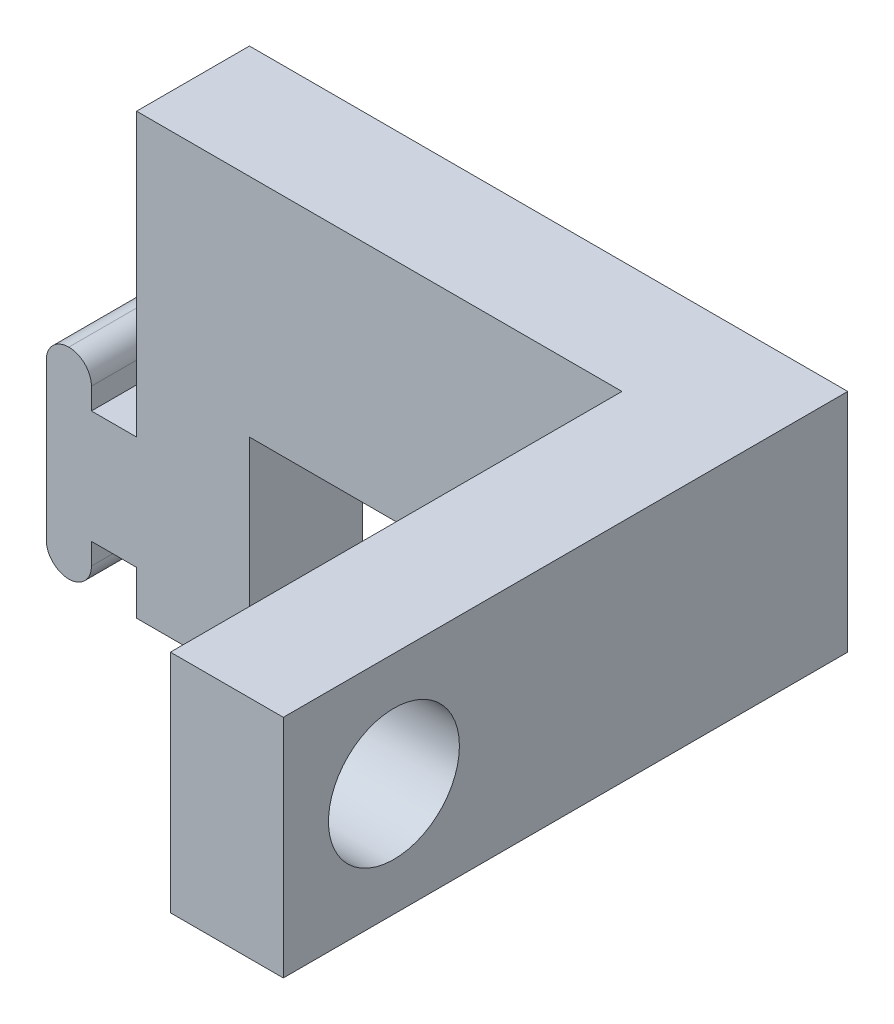
ISO-10303-21;
HEADER;
FILE_DESCRIPTION(('STEP AP214'),'2;1');
FILE_NAME('part.step','',(''),(''),'','','');
FILE_SCHEMA(('AUTOMOTIVE_DESIGN { 1 0 10303 214 1 1 1 1 }'));
ENDSEC;
DATA;
#1=APPLICATION_CONTEXT('core data for automotive mechanical design processes');
#2=APPLICATION_PROTOCOL_DEFINITION('international standard','automotive_design',2000,#1);
#3=PRODUCT_CONTEXT('',#1,'mechanical');
#4=PRODUCT('Part','Part','',(#3));
#5=PRODUCT_RELATED_PRODUCT_CATEGORY('part','',(#4));
#6=PRODUCT_DEFINITION_FORMATION('','',#4);
#7=PRODUCT_DEFINITION_CONTEXT('part definition',#1,'design');
#8=PRODUCT_DEFINITION('design','',#6,#7);
#9=PRODUCT_DEFINITION_SHAPE('','',#8);
#10=(LENGTH_UNIT() NAMED_UNIT(*) SI_UNIT(.MILLI.,.METRE.));
#11=(NAMED_UNIT(*) PLANE_ANGLE_UNIT() SI_UNIT($,.RADIAN.));
#12=(NAMED_UNIT(*) SI_UNIT($,.STERADIAN.) SOLID_ANGLE_UNIT());
#13=UNCERTAINTY_MEASURE_WITH_UNIT(LENGTH_MEASURE(1.E-05),#10,'distance_accuracy_value','');
#14=(GEOMETRIC_REPRESENTATION_CONTEXT(3) GLOBAL_UNCERTAINTY_ASSIGNED_CONTEXT((#13)) GLOBAL_UNIT_ASSIGNED_CONTEXT((#10,
#11,#12)) REPRESENTATION_CONTEXT('',''));
#15=CARTESIAN_POINT('',(0.,0.,0.));
#16=DIRECTION('',(0.,0.,1.));
#17=DIRECTION('',(1.,0.,0.));
#18=AXIS2_PLACEMENT_3D('',#15,#16,#17);
#19=CARTESIAN_POINT('',(-6.35,12.7,0.));
#20=DIRECTION('',(0.,0.,-1.));
#21=DIRECTION('',(-1.,0.,0.));
#22=AXIS2_PLACEMENT_3D('',#19,#20,#21);
#23=PLANE('',#22);
#24=DIRECTION('',(1.,0.,0.));
#25=VECTOR('',#24,1.);
#26=CARTESIAN_POINT('',(-6.35,0.,0.));
#27=LINE('',#26,#25);
#28=CARTESIAN_POINT('',(-6.35,0.,0.));
#29=VERTEX_POINT('',#28);
#30=CARTESIAN_POINT('',(0.,0.,0.));
#31=VERTEX_POINT('',#30);
#32=EDGE_CURVE('E239',#29,#31,#27,.T.);
#33=ORIENTED_EDGE('',*,*,#32,.T.);
#34=DIRECTION('',(0.,-1.,0.));
#35=VECTOR('',#34,1.);
#36=CARTESIAN_POINT('',(0.,12.7,0.));
#37=LINE('',#36,#35);
#38=CARTESIAN_POINT('',(0.,12.7,0.));
#39=VERTEX_POINT('',#38);
#40=EDGE_CURVE('E277',#39,#31,#37,.T.);
#41=ORIENTED_EDGE('',*,*,#40,.F.);
#42=DIRECTION('',(1.,0.,0.));
#43=VECTOR('',#42,1.);
#44=CARTESIAN_POINT('',(-6.35,12.7,0.));
#45=LINE('',#44,#43);
#46=CARTESIAN_POINT('',(-6.35,12.7,0.));
#47=VERTEX_POINT('',#46);
#48=EDGE_CURVE('E252',#47,#39,#45,.T.);
#49=ORIENTED_EDGE('',*,*,#48,.F.);
#50=DIRECTION('',(0.,-1.,0.));
#51=VECTOR('',#50,1.);
#52=CARTESIAN_POINT('',(-6.35,12.7,0.));
#53=LINE('',#52,#51);
#54=EDGE_CURVE('E263',#47,#29,#53,.T.);
#55=ORIENTED_EDGE('',*,*,#54,.T.);
#56=EDGE_LOOP('',(#33,#41,#49,#55));
#57=FACE_BOUND('',#56,.T.);
#58=ADVANCED_FACE('F35',(#57),#23,.F.);
#59=CARTESIAN_POINT('',(0.,12.7,0.));
#60=DIRECTION('',(-1.,0.,0.));
#61=DIRECTION('',(0.,0.,1.));
#62=AXIS2_PLACEMENT_3D('',#59,#60,#61);
#63=PLANE('',#62);
#64=CARTESIAN_POINT('',(0.,6.35,-6.223));
#65=DIRECTION('',(-1.,0.,0.));
#66=DIRECTION('',(0.,0.,1.));
#67=AXIS2_PLACEMENT_3D('',#64,#65,#66);
#68=CIRCLE('',#67,3.683);
#69=CARTESIAN_POINT('',(0.,6.35,-9.906));
#70=VERTEX_POINT('',#69);
#71=EDGE_CURVE('E196',#70,#70,#68,.T.);
#72=ORIENTED_EDGE('',*,*,#71,.T.);
#73=EDGE_LOOP('',(#72));
#74=FACE_BOUND('',#73,.T.);
#75=DIRECTION('',(0.,0.,-1.));
#76=VECTOR('',#75,1.);
#77=CARTESIAN_POINT('',(0.,0.,0.));
#78=LINE('',#77,#76);
#79=CARTESIAN_POINT('',(0.,0.,-31.75));
#80=VERTEX_POINT('',#79);
#81=EDGE_CURVE('E266',#31,#80,#78,.T.);
#82=ORIENTED_EDGE('',*,*,#81,.T.);
#83=DIRECTION('',(0.,-1.,0.));
#84=VECTOR('',#83,1.);
#85=CARTESIAN_POINT('',(0.,12.7,-31.75));
#86=LINE('',#85,#84);
#87=CARTESIAN_POINT('',(0.,12.7,-31.75));
#88=VERTEX_POINT('',#87);
#89=EDGE_CURVE('E274',#88,#80,#86,.T.);
#90=ORIENTED_EDGE('',*,*,#89,.F.);
#91=DIRECTION('',(0.,0.,-1.));
#92=VECTOR('',#91,1.);
#93=CARTESIAN_POINT('',(0.,12.7,0.));
#94=LINE('',#93,#92);
#95=EDGE_CURVE('E255',#39,#88,#94,.T.);
#96=ORIENTED_EDGE('',*,*,#95,.F.);
#97=ORIENTED_EDGE('',*,*,#40,.T.);
#98=EDGE_LOOP('',(#82,#90,#96,#97));
#99=FACE_BOUND('',#98,.T.);
#100=ADVANCED_FACE('F326',(#74,#99),#63,.F.);
#101=CARTESIAN_POINT('',(0.,12.7,-31.75));
#102=DIRECTION('',(0.,0.,1.));
#103=DIRECTION('',(1.,0.,0.));
#104=AXIS2_PLACEMENT_3D('',#101,#102,#103);
#105=PLANE('',#104);
#106=DIRECTION('',(0.,-1.,0.));
#107=VECTOR('',#106,1.);
#108=CARTESIAN_POINT('',(-36.195,-9.525,-31.75));
#109=LINE('',#108,#107);
#110=CARTESIAN_POINT('',(-36.195,-9.525,-31.75));
#111=VERTEX_POINT('',#110);
#112=CARTESIAN_POINT('',(-36.195,-10.7315,-31.75));
#113=VERTEX_POINT('',#112);
#114=EDGE_CURVE('E226',#111,#113,#109,.T.);
#115=ORIENTED_EDGE('',*,*,#114,.T.);
#116=CARTESIAN_POINT('',(-37.465,-10.7315,-31.75));
#117=DIRECTION('',(0.,0.,1.));
#118=DIRECTION('',(1.,0.,0.));
#119=AXIS2_PLACEMENT_3D('',#116,#117,#118);
#120=CIRCLE('',#119,1.27);
#121=CARTESIAN_POINT('',(-37.465,-12.0015,-31.75));
#122=VERTEX_POINT('',#121);
#123=EDGE_CURVE('E296',#113,#122,#120,.F.);
#124=ORIENTED_EDGE('',*,*,#123,.T.);
#125=CARTESIAN_POINT('',(-37.465,-10.7315,-31.75));
#126=DIRECTION('',(0.,0.,1.));
#127=DIRECTION('',(1.,0.,0.));
#128=AXIS2_PLACEMENT_3D('',#125,#126,#127);
#129=CIRCLE('',#128,1.27);
#130=CARTESIAN_POINT('',(-38.735,-10.7315,-31.75));
#131=VERTEX_POINT('',#130);
#132=EDGE_CURVE('E294',#122,#131,#129,.F.);
#133=ORIENTED_EDGE('',*,*,#132,.T.);
#134=DIRECTION('',(0.,1.,0.));
#135=VECTOR('',#134,1.);
#136=CARTESIAN_POINT('',(-38.735,-0.698499999999999,-31.75));
#137=LINE('',#136,#135);
#138=CARTESIAN_POINT('',(-38.735,-1.9685,-31.75));
#139=VERTEX_POINT('',#138);
#140=EDGE_CURVE('E229',#131,#139,#137,.T.);
#141=ORIENTED_EDGE('',*,*,#140,.T.);
#142=CARTESIAN_POINT('',(-37.465,-1.9685,-31.75));
#143=DIRECTION('',(0.,0.,1.));
#144=DIRECTION('',(1.,0.,0.));
#145=AXIS2_PLACEMENT_3D('',#142,#143,#144);
#146=CIRCLE('',#145,1.27);
#147=CARTESIAN_POINT('',(-37.465,-0.698499999999999,-31.75));
#148=VERTEX_POINT('',#147);
#149=EDGE_CURVE('E292',#139,#148,#146,.F.);
#150=ORIENTED_EDGE('',*,*,#149,.T.);
#151=CARTESIAN_POINT('',(-37.465,-1.9685,-31.75));
#152=DIRECTION('',(0.,0.,1.));
#153=DIRECTION('',(1.,0.,0.));
#154=AXIS2_PLACEMENT_3D('',#151,#152,#153);
#155=CIRCLE('',#154,1.27);
#156=CARTESIAN_POINT('',(-36.195,-1.9685,-31.75));
#157=VERTEX_POINT('',#156);
#158=EDGE_CURVE('E283',#148,#157,#155,.F.);
#159=ORIENTED_EDGE('',*,*,#158,.T.);
#160=DIRECTION('',(0.,-1.,0.));
#161=VECTOR('',#160,1.);
#162=CARTESIAN_POINT('',(-36.195,-3.175,-31.75));
#163=LINE('',#162,#161);
#164=CARTESIAN_POINT('',(-36.195,-3.175,-31.75));
#165=VERTEX_POINT('',#164);
#166=EDGE_CURVE('E232',#157,#165,#163,.T.);
#167=ORIENTED_EDGE('',*,*,#166,.T.);
#168=DIRECTION('',(1.,0.,0.));
#169=VECTOR('',#168,1.);
#170=CARTESIAN_POINT('',(-33.655,-3.175,-31.75));
#171=LINE('',#170,#169);
#172=CARTESIAN_POINT('',(-33.655,-3.175,-31.75));
#173=VERTEX_POINT('',#172);
#174=EDGE_CURVE('E193',#165,#173,#171,.T.);
#175=ORIENTED_EDGE('',*,*,#174,.T.);
#176=DIRECTION('',(0.,1.,0.));
#177=VECTOR('',#176,1.);
#178=CARTESIAN_POINT('',(-33.655,12.7,-31.75));
#179=LINE('',#178,#177);
#180=CARTESIAN_POINT('',(-33.655,12.7,-31.75));
#181=VERTEX_POINT('',#180);
#182=EDGE_CURVE('E188',#173,#181,#179,.T.);
#183=ORIENTED_EDGE('',*,*,#182,.T.);
#184=DIRECTION('',(-1.,0.,0.));
#185=VECTOR('',#184,1.);
#186=CARTESIAN_POINT('',(0.,12.7,-31.75));
#187=LINE('',#186,#185);
#188=EDGE_CURVE('E257',#88,#181,#187,.T.);
#189=ORIENTED_EDGE('',*,*,#188,.F.);
#190=ORIENTED_EDGE('',*,*,#89,.T.);
#191=DIRECTION('',(-1.,0.,0.));
#192=VECTOR('',#191,1.);
#193=CARTESIAN_POINT('',(0.,0.,-31.75));
#194=LINE('',#193,#192);
#195=CARTESIAN_POINT('',(-27.305,0.,-31.75));
#196=VERTEX_POINT('',#195);
#197=EDGE_CURVE('E172',#80,#196,#194,.T.);
#198=ORIENTED_EDGE('',*,*,#197,.T.);
#199=DIRECTION('',(0.,-1.,0.));
#200=VECTOR('',#199,1.);
#201=CARTESIAN_POINT('',(-27.305,-12.0015,-31.75));
#202=LINE('',#201,#200);
#203=CARTESIAN_POINT('',(-27.305,-12.0015,-31.75));
#204=VERTEX_POINT('',#203);
#205=EDGE_CURVE('E179',#196,#204,#202,.T.);
#206=ORIENTED_EDGE('',*,*,#205,.T.);
#207=DIRECTION('',(-1.,0.,0.));
#208=VECTOR('',#207,1.);
#209=CARTESIAN_POINT('',(-27.305,-12.0015,-31.75));
#210=LINE('',#209,#208);
#211=CARTESIAN_POINT('',(-33.655,-12.0015,-31.75));
#212=VERTEX_POINT('',#211);
#213=EDGE_CURVE('E216',#204,#212,#210,.T.);
#214=ORIENTED_EDGE('',*,*,#213,.T.);
#215=DIRECTION('',(0.,1.,0.));
#216=VECTOR('',#215,1.);
#217=CARTESIAN_POINT('',(-33.655,-12.0015,-31.75));
#218=LINE('',#217,#216);
#219=CARTESIAN_POINT('',(-33.655,-9.525,-31.75));
#220=VERTEX_POINT('',#219);
#221=EDGE_CURVE('E220',#212,#220,#218,.T.);
#222=ORIENTED_EDGE('',*,*,#221,.T.);
#223=DIRECTION('',(-1.,0.,0.));
#224=VECTOR('',#223,1.);
#225=CARTESIAN_POINT('',(-33.655,-9.525,-31.75));
#226=LINE('',#225,#224);
#227=EDGE_CURVE('E223',#220,#111,#226,.T.);
#228=ORIENTED_EDGE('',*,*,#227,.T.);
#229=EDGE_LOOP('',(#115,#124,#133,#141,#150,#159,#167,#175,#183,#189,#190,#198,#206,#214,#222,#228));
#230=FACE_BOUND('',#229,.T.);
#231=ADVANCED_FACE('F332',(#230),#105,.F.);
#232=CARTESIAN_POINT('',(-22.86,12.7,-25.4));
#233=DIRECTION('',(0.,0.,-1.));
#234=DIRECTION('',(-1.,0.,0.));
#235=AXIS2_PLACEMENT_3D('',#232,#233,#234);
#236=PLANE('',#235);
#237=CARTESIAN_POINT('',(-37.465,-10.7315,-25.4));
#238=DIRECTION('',(0.,0.,-1.));
#239=DIRECTION('',(-1.,0.,0.));
#240=AXIS2_PLACEMENT_3D('',#237,#238,#239);
#241=CIRCLE('',#240,1.27);
#242=CARTESIAN_POINT('',(-38.735,-10.7315,-25.4));
#243=VERTEX_POINT('',#242);
#244=CARTESIAN_POINT('',(-37.465,-12.0015,-25.4));
#245=VERTEX_POINT('',#244);
#246=EDGE_CURVE('E52',#243,#245,#241,.F.);
#247=ORIENTED_EDGE('',*,*,#246,.T.);
#248=CARTESIAN_POINT('',(-37.465,-10.7315,-25.4));
#249=DIRECTION('',(0.,0.,-1.));
#250=DIRECTION('',(-1.,0.,0.));
#251=AXIS2_PLACEMENT_3D('',#248,#249,#250);
#252=CIRCLE('',#251,1.27);
#253=CARTESIAN_POINT('',(-36.195,-10.7315,-25.4));
#254=VERTEX_POINT('',#253);
#255=EDGE_CURVE('E300',#245,#254,#252,.F.);
#256=ORIENTED_EDGE('',*,*,#255,.T.);
#257=DIRECTION('',(0.,-1.,0.));
#258=VECTOR('',#257,1.);
#259=CARTESIAN_POINT('',(-36.195,-9.525,-25.4));
#260=LINE('',#259,#258);
#261=CARTESIAN_POINT('',(-36.195,-9.525,-25.4));
#262=VERTEX_POINT('',#261);
#263=EDGE_CURVE('E203',#262,#254,#260,.T.);
#264=ORIENTED_EDGE('',*,*,#263,.F.);
#265=DIRECTION('',(-1.,0.,0.));
#266=VECTOR('',#265,1.);
#267=CARTESIAN_POINT('',(-33.655,-9.525,-25.4));
#268=LINE('',#267,#266);
#269=CARTESIAN_POINT('',(-33.655,-9.525,-25.4));
#270=VERTEX_POINT('',#269);
#271=EDGE_CURVE('E200',#270,#262,#268,.T.);
#272=ORIENTED_EDGE('',*,*,#271,.F.);
#273=DIRECTION('',(0.,1.,0.));
#274=VECTOR('',#273,1.);
#275=CARTESIAN_POINT('',(-33.655,-12.0015,-25.4));
#276=LINE('',#275,#274);
#277=CARTESIAN_POINT('',(-33.655,-12.0015,-25.4));
#278=VERTEX_POINT('',#277);
#279=EDGE_CURVE('E190',#278,#270,#276,.T.);
#280=ORIENTED_EDGE('',*,*,#279,.F.);
#281=DIRECTION('',(-1.,0.,0.));
#282=VECTOR('',#281,1.);
#283=CARTESIAN_POINT('',(-27.305,-12.0015,-25.4));
#284=LINE('',#283,#282);
#285=CARTESIAN_POINT('',(-27.305,-12.0015,-25.4));
#286=VERTEX_POINT('',#285);
#287=EDGE_CURVE('E187',#286,#278,#284,.T.);
#288=ORIENTED_EDGE('',*,*,#287,.F.);
#289=DIRECTION('',(0.,-1.,0.));
#290=VECTOR('',#289,1.);
#291=CARTESIAN_POINT('',(-27.305,-12.0015,-25.4));
#292=LINE('',#291,#290);
#293=CARTESIAN_POINT('',(-27.305,0.,-25.4));
#294=VERTEX_POINT('',#293);
#295=EDGE_CURVE('E177',#294,#286,#292,.T.);
#296=ORIENTED_EDGE('',*,*,#295,.F.);
#297=DIRECTION('',(1.,0.,0.));
#298=VECTOR('',#297,1.);
#299=CARTESIAN_POINT('',(-22.86,0.,-25.4));
#300=LINE('',#299,#298);
#301=CARTESIAN_POINT('',(-6.35,0.,-25.4));
#302=VERTEX_POINT('',#301);
#303=EDGE_CURVE('E161',#294,#302,#300,.T.);
#304=ORIENTED_EDGE('',*,*,#303,.T.);
#305=DIRECTION('',(0.,-1.,0.));
#306=VECTOR('',#305,1.);
#307=CARTESIAN_POINT('',(-6.35,12.7,-25.4));
#308=LINE('',#307,#306);
#309=CARTESIAN_POINT('',(-6.35,12.7,-25.4));
#310=VERTEX_POINT('',#309);
#311=EDGE_CURVE('E272',#310,#302,#308,.T.);
#312=ORIENTED_EDGE('',*,*,#311,.F.);
#313=DIRECTION('',(1.,0.,0.));
#314=VECTOR('',#313,1.);
#315=CARTESIAN_POINT('',(-22.86,12.7,-25.4));
#316=LINE('',#315,#314);
#317=CARTESIAN_POINT('',(-33.655,12.7,-25.4));
#318=VERTEX_POINT('',#317);
#319=EDGE_CURVE('E259',#318,#310,#316,.T.);
#320=ORIENTED_EDGE('',*,*,#319,.F.);
#321=DIRECTION('',(0.,1.,0.));
#322=VECTOR('',#321,1.);
#323=CARTESIAN_POINT('',(-33.655,12.7,-25.4));
#324=LINE('',#323,#322);
#325=CARTESIAN_POINT('',(-33.655,-3.175,-25.4));
#326=VERTEX_POINT('',#325);
#327=EDGE_CURVE('E181',#326,#318,#324,.T.);
#328=ORIENTED_EDGE('',*,*,#327,.F.);
#329=DIRECTION('',(1.,0.,0.));
#330=VECTOR('',#329,1.);
#331=CARTESIAN_POINT('',(-33.655,-3.175,-25.4));
#332=LINE('',#331,#330);
#333=CARTESIAN_POINT('',(-36.195,-3.175,-25.4));
#334=VERTEX_POINT('',#333);
#335=EDGE_CURVE('E210',#334,#326,#332,.T.);
#336=ORIENTED_EDGE('',*,*,#335,.F.);
#337=DIRECTION('',(0.,-1.,0.));
#338=VECTOR('',#337,1.);
#339=CARTESIAN_POINT('',(-36.195,-3.175,-25.4));
#340=LINE('',#339,#338);
#341=CARTESIAN_POINT('',(-36.195,-1.9685,-25.4));
#342=VERTEX_POINT('',#341);
#343=EDGE_CURVE('E208',#342,#334,#340,.T.);
#344=ORIENTED_EDGE('',*,*,#343,.F.);
#345=CARTESIAN_POINT('',(-37.465,-1.9685,-25.4));
#346=DIRECTION('',(0.,0.,-1.));
#347=DIRECTION('',(-1.,0.,0.));
#348=AXIS2_PLACEMENT_3D('',#345,#346,#347);
#349=CIRCLE('',#348,1.27);
#350=CARTESIAN_POINT('',(-37.465,-0.698499999999999,-25.4));
#351=VERTEX_POINT('',#350);
#352=EDGE_CURVE('E287',#342,#351,#349,.F.);
#353=ORIENTED_EDGE('',*,*,#352,.T.);
#354=CARTESIAN_POINT('',(-37.465,-1.9685,-25.4));
#355=DIRECTION('',(0.,0.,-1.));
#356=DIRECTION('',(-1.,0.,0.));
#357=AXIS2_PLACEMENT_3D('',#354,#355,#356);
#358=CIRCLE('',#357,1.27);
#359=CARTESIAN_POINT('',(-38.735,-1.9685,-25.4));
#360=VERTEX_POINT('',#359);
#361=EDGE_CURVE('E58',#351,#360,#358,.F.);
#362=ORIENTED_EDGE('',*,*,#361,.T.);
#363=DIRECTION('',(0.,1.,0.));
#364=VECTOR('',#363,1.);
#365=CARTESIAN_POINT('',(-38.735,-0.698499999999999,-25.4));
#366=LINE('',#365,#364);
#367=EDGE_CURVE('E206',#243,#360,#366,.T.);
#368=ORIENTED_EDGE('',*,*,#367,.F.);
#369=EDGE_LOOP('',(#247,#256,#264,#272,#280,#288,#296,#304,#312,#320,#328,#336,#344,#353,#362,#368));
#370=FACE_BOUND('',#369,.T.);
#371=ADVANCED_FACE('F184',(#370),#236,.F.);
#372=CARTESIAN_POINT('',(-6.35,12.7,-25.4));
#373=DIRECTION('',(1.,0.,0.));
#374=DIRECTION('',(0.,0.,-1.));
#375=AXIS2_PLACEMENT_3D('',#372,#373,#374);
#376=PLANE('',#375);
#377=CARTESIAN_POINT('',(-6.35,6.35,-6.223));
#378=DIRECTION('',(1.,0.,0.));
#379=DIRECTION('',(0.,0.,-1.));
#380=AXIS2_PLACEMENT_3D('',#377,#378,#379);
#381=CIRCLE('',#380,3.683);
#382=CARTESIAN_POINT('',(-6.35,6.35,-9.906));
#383=VERTEX_POINT('',#382);
#384=EDGE_CURVE('E39',#383,#383,#381,.T.);
#385=ORIENTED_EDGE('',*,*,#384,.T.);
#386=EDGE_LOOP('',(#385));
#387=FACE_BOUND('',#386,.T.);
#388=DIRECTION('',(0.,0.,1.));
#389=VECTOR('',#388,1.);
#390=CARTESIAN_POINT('',(-6.35,0.,-25.4));
#391=LINE('',#390,#389);
#392=EDGE_CURVE('E168',#302,#29,#391,.T.);
#393=ORIENTED_EDGE('',*,*,#392,.T.);
#394=ORIENTED_EDGE('',*,*,#54,.F.);
#395=DIRECTION('',(0.,0.,1.));
#396=VECTOR('',#395,1.);
#397=CARTESIAN_POINT('',(-6.35,12.7,-25.4));
#398=LINE('',#397,#396);
#399=EDGE_CURVE('E261',#310,#47,#398,.T.);
#400=ORIENTED_EDGE('',*,*,#399,.F.);
#401=ORIENTED_EDGE('',*,*,#311,.T.);
#402=EDGE_LOOP('',(#393,#394,#400,#401));
#403=FACE_BOUND('',#402,.T.);
#404=ADVANCED_FACE('F312',(#387,#403),#376,.F.);
#405=CARTESIAN_POINT('',(0.,12.7,0.));
#406=DIRECTION('',(0.,1.,0.));
#407=DIRECTION('',(0.,0.,1.));
#408=AXIS2_PLACEMENT_3D('',#405,#406,#407);
#409=PLANE('',#408);
#410=ORIENTED_EDGE('',*,*,#48,.T.);
#411=ORIENTED_EDGE('',*,*,#95,.T.);
#412=ORIENTED_EDGE('',*,*,#188,.T.);
#413=DIRECTION('',(0.,0.,-1.));
#414=VECTOR('',#413,1.);
#415=CARTESIAN_POINT('',(-33.655,12.7,-25.4));
#416=LINE('',#415,#414);
#417=EDGE_CURVE('E236',#318,#181,#416,.T.);
#418=ORIENTED_EDGE('',*,*,#417,.F.);
#419=ORIENTED_EDGE('',*,*,#319,.T.);
#420=ORIENTED_EDGE('',*,*,#399,.T.);
#421=EDGE_LOOP('',(#410,#411,#412,#418,#419,#420));
#422=FACE_BOUND('',#421,.T.);
#423=ADVANCED_FACE('F375',(#422),#409,.T.);
#424=CARTESIAN_POINT('',(0.,0.,0.));
#425=DIRECTION('',(0.,1.,0.));
#426=DIRECTION('',(0.,0.,1.));
#427=AXIS2_PLACEMENT_3D('',#424,#425,#426);
#428=PLANE('',#427);
#429=ORIENTED_EDGE('',*,*,#32,.F.);
#430=ORIENTED_EDGE('',*,*,#392,.F.);
#431=ORIENTED_EDGE('',*,*,#303,.F.);
#432=DIRECTION('',(0.,0.,-1.));
#433=VECTOR('',#432,1.);
#434=CARTESIAN_POINT('',(-27.305,0.,-25.4));
#435=LINE('',#434,#433);
#436=EDGE_CURVE('E166',#294,#196,#435,.T.);
#437=ORIENTED_EDGE('',*,*,#436,.T.);
#438=ORIENTED_EDGE('',*,*,#197,.F.);
#439=ORIENTED_EDGE('',*,*,#81,.F.);
#440=EDGE_LOOP('',(#429,#430,#431,#437,#438,#439));
#441=FACE_BOUND('',#440,.T.);
#442=ADVANCED_FACE('F164',(#441),#428,.F.);
#443=CARTESIAN_POINT('',(-33.655,12.7,-25.4));
#444=DIRECTION('',(-1.,0.,0.));
#445=DIRECTION('',(0.,-1.,0.));
#446=AXIS2_PLACEMENT_3D('',#443,#444,#445);
#447=PLANE('',#446);
#448=ORIENTED_EDGE('',*,*,#182,.F.);
#449=DIRECTION('',(0.,0.,-1.));
#450=VECTOR('',#449,1.);
#451=CARTESIAN_POINT('',(-33.655,-3.175,-25.4));
#452=LINE('',#451,#450);
#453=EDGE_CURVE('E240',#326,#173,#452,.T.);
#454=ORIENTED_EDGE('',*,*,#453,.F.);
#455=ORIENTED_EDGE('',*,*,#327,.T.);
#456=ORIENTED_EDGE('',*,*,#417,.T.);
#457=EDGE_LOOP('',(#448,#454,#455,#456));
#458=FACE_BOUND('',#457,.T.);
#459=ADVANCED_FACE('F378',(#458),#447,.T.);
#460=CARTESIAN_POINT('',(-33.655,-3.175,-25.4));
#461=DIRECTION('',(0.,1.,0.));
#462=DIRECTION('',(0.,0.,1.));
#463=AXIS2_PLACEMENT_3D('',#460,#461,#462);
#464=PLANE('',#463);
#465=ORIENTED_EDGE('',*,*,#174,.F.);
#466=DIRECTION('',(0.,0.,-1.));
#467=VECTOR('',#466,1.);
#468=CARTESIAN_POINT('',(-36.195,-3.175,-25.4));
#469=LINE('',#468,#467);
#470=EDGE_CURVE('E242',#334,#165,#469,.T.);
#471=ORIENTED_EDGE('',*,*,#470,.F.);
#472=ORIENTED_EDGE('',*,*,#335,.T.);
#473=ORIENTED_EDGE('',*,*,#453,.T.);
#474=EDGE_LOOP('',(#465,#471,#472,#473));
#475=FACE_BOUND('',#474,.T.);
#476=ADVANCED_FACE('F381',(#475),#464,.T.);
#477=CARTESIAN_POINT('',(-36.195,-3.175,-25.4));
#478=DIRECTION('',(1.,0.,0.));
#479=DIRECTION('',(0.,0.,-1.));
#480=AXIS2_PLACEMENT_3D('',#477,#478,#479);
#481=PLANE('',#480);
#482=ORIENTED_EDGE('',*,*,#166,.F.);
#483=DIRECTION('',(0.,0.,-1.));
#484=VECTOR('',#483,1.);
#485=CARTESIAN_POINT('',(-36.195,-1.9685,-25.4));
#486=LINE('',#485,#484);
#487=EDGE_CURVE('E285',#157,#342,#486,.F.);
#488=ORIENTED_EDGE('',*,*,#487,.T.);
#489=ORIENTED_EDGE('',*,*,#343,.T.);
#490=ORIENTED_EDGE('',*,*,#470,.T.);
#491=EDGE_LOOP('',(#482,#488,#489,#490));
#492=FACE_BOUND('',#491,.T.);
#493=ADVANCED_FACE('F394',(#492),#481,.T.);
#494=CARTESIAN_POINT('',(-38.735,-0.698499999999999,-25.4));
#495=DIRECTION('',(-1.,0.,0.));
#496=DIRECTION('',(0.,0.,1.));
#497=AXIS2_PLACEMENT_3D('',#494,#495,#496);
#498=PLANE('',#497);
#499=ORIENTED_EDGE('',*,*,#140,.F.);
#500=DIRECTION('',(0.,0.,-1.));
#501=VECTOR('',#500,1.);
#502=CARTESIAN_POINT('',(-38.735,-10.7315,-25.4));
#503=LINE('',#502,#501);
#504=EDGE_CURVE('E11',#131,#243,#503,.F.);
#505=ORIENTED_EDGE('',*,*,#504,.T.);
#506=ORIENTED_EDGE('',*,*,#367,.T.);
#507=DIRECTION('',(0.,0.,-1.));
#508=VECTOR('',#507,1.);
#509=CARTESIAN_POINT('',(-38.735,-1.9685,-25.4));
#510=LINE('',#509,#508);
#511=EDGE_CURVE('E44',#360,#139,#510,.T.);
#512=ORIENTED_EDGE('',*,*,#511,.T.);
#513=EDGE_LOOP('',(#499,#505,#506,#512));
#514=FACE_BOUND('',#513,.T.);
#515=ADVANCED_FACE('F392',(#514),#498,.T.);
#516=CARTESIAN_POINT('',(-36.195,-9.525,-25.4));
#517=DIRECTION('',(1.,0.,0.));
#518=DIRECTION('',(0.,0.,-1.));
#519=AXIS2_PLACEMENT_3D('',#516,#517,#518);
#520=PLANE('',#519);
#521=ORIENTED_EDGE('',*,*,#263,.T.);
#522=DIRECTION('',(0.,0.,-1.));
#523=VECTOR('',#522,1.);
#524=CARTESIAN_POINT('',(-36.195,-10.7315,-25.4));
#525=LINE('',#524,#523);
#526=EDGE_CURVE('E289',#254,#113,#525,.T.);
#527=ORIENTED_EDGE('',*,*,#526,.T.);
#528=ORIENTED_EDGE('',*,*,#114,.F.);
#529=DIRECTION('',(0.,0.,-1.));
#530=VECTOR('',#529,1.);
#531=CARTESIAN_POINT('',(-36.195,-9.525,-25.4));
#532=LINE('',#531,#530);
#533=EDGE_CURVE('E245',#262,#111,#532,.T.);
#534=ORIENTED_EDGE('',*,*,#533,.F.);
#535=EDGE_LOOP('',(#521,#527,#528,#534));
#536=FACE_BOUND('',#535,.T.);
#537=ADVANCED_FACE('F352',(#536),#520,.T.);
#538=CARTESIAN_POINT('',(-33.655,-9.525,-25.4));
#539=DIRECTION('',(0.,-1.,0.));
#540=DIRECTION('',(0.,0.,-1.));
#541=AXIS2_PLACEMENT_3D('',#538,#539,#540);
#542=PLANE('',#541);
#543=ORIENTED_EDGE('',*,*,#227,.F.);
#544=DIRECTION('',(0.,0.,-1.));
#545=VECTOR('',#544,1.);
#546=CARTESIAN_POINT('',(-33.655,-9.525,-25.4));
#547=LINE('',#546,#545);
#548=EDGE_CURVE('E247',#270,#220,#547,.T.);
#549=ORIENTED_EDGE('',*,*,#548,.F.);
#550=ORIENTED_EDGE('',*,*,#271,.T.);
#551=ORIENTED_EDGE('',*,*,#533,.T.);
#552=EDGE_LOOP('',(#543,#549,#550,#551));
#553=FACE_BOUND('',#552,.T.);
#554=ADVANCED_FACE('F356',(#553),#542,.T.);
#555=CARTESIAN_POINT('',(-33.655,-12.0015,-25.4));
#556=DIRECTION('',(-1.,0.,0.));
#557=DIRECTION('',(0.,-1.,0.));
#558=AXIS2_PLACEMENT_3D('',#555,#556,#557);
#559=PLANE('',#558);
#560=ORIENTED_EDGE('',*,*,#221,.F.);
#561=DIRECTION('',(0.,0.,-1.));
#562=VECTOR('',#561,1.);
#563=CARTESIAN_POINT('',(-33.655,-12.0015,-25.4));
#564=LINE('',#563,#562);
#565=EDGE_CURVE('E249',#278,#212,#564,.T.);
#566=ORIENTED_EDGE('',*,*,#565,.F.);
#567=ORIENTED_EDGE('',*,*,#279,.T.);
#568=ORIENTED_EDGE('',*,*,#548,.T.);
#569=EDGE_LOOP('',(#560,#566,#567,#568));
#570=FACE_BOUND('',#569,.T.);
#571=ADVANCED_FACE('F359',(#570),#559,.T.);
#572=CARTESIAN_POINT('',(-27.305,-12.0015,-25.4));
#573=DIRECTION('',(0.,-1.,0.));
#574=DIRECTION('',(0.,0.,-1.));
#575=AXIS2_PLACEMENT_3D('',#572,#573,#574);
#576=PLANE('',#575);
#577=ORIENTED_EDGE('',*,*,#213,.F.);
#578=DIRECTION('',(0.,0.,-1.));
#579=VECTOR('',#578,1.);
#580=CARTESIAN_POINT('',(-27.305,-12.0015,-25.4));
#581=LINE('',#580,#579);
#582=EDGE_CURVE('E180',#286,#204,#581,.T.);
#583=ORIENTED_EDGE('',*,*,#582,.F.);
#584=ORIENTED_EDGE('',*,*,#287,.T.);
#585=ORIENTED_EDGE('',*,*,#565,.T.);
#586=EDGE_LOOP('',(#577,#583,#584,#585));
#587=FACE_BOUND('',#586,.T.);
#588=ADVANCED_FACE('F362',(#587),#576,.T.);
#589=CARTESIAN_POINT('',(-27.305,-12.0015,-25.4));
#590=DIRECTION('',(1.,0.,0.));
#591=DIRECTION('',(0.,0.,-1.));
#592=AXIS2_PLACEMENT_3D('',#589,#590,#591);
#593=PLANE('',#592);
#594=ORIENTED_EDGE('',*,*,#205,.F.);
#595=ORIENTED_EDGE('',*,*,#436,.F.);
#596=ORIENTED_EDGE('',*,*,#295,.T.);
#597=ORIENTED_EDGE('',*,*,#582,.T.);
#598=EDGE_LOOP('',(#594,#595,#596,#597));
#599=FACE_BOUND('',#598,.T.);
#600=ADVANCED_FACE('F176',(#599),#593,.T.);
#601=CARTESIAN_POINT('',(-37.465,-1.9685,-25.4));
#602=DIRECTION('',(0.,0.,-1.));
#603=DIRECTION('',(-1.,0.,0.));
#604=AXIS2_PLACEMENT_3D('',#601,#602,#603);
#605=CYLINDRICAL_SURFACE('',#604,1.27);
#606=ORIENTED_EDGE('',*,*,#352,.F.);
#607=ORIENTED_EDGE('',*,*,#487,.F.);
#608=ORIENTED_EDGE('',*,*,#158,.F.);
#609=DIRECTION('',(0.,0.,-1.));
#610=VECTOR('',#609,1.);
#611=CARTESIAN_POINT('',(-37.465,-0.698499999999999,-25.4));
#612=LINE('',#611,#610);
#613=EDGE_CURVE('E280',#351,#148,#612,.T.);
#614=ORIENTED_EDGE('',*,*,#613,.F.);
#615=EDGE_LOOP('',(#606,#607,#608,#614));
#616=FACE_BOUND('',#615,.T.);
#617=ADVANCED_FACE('F336',(#616),#605,.T.);
#618=CARTESIAN_POINT('',(-37.465,-10.7315,-25.4));
#619=DIRECTION('',(0.,0.,-1.));
#620=DIRECTION('',(-1.,0.,0.));
#621=AXIS2_PLACEMENT_3D('',#618,#619,#620);
#622=CYLINDRICAL_SURFACE('',#621,1.27);
#623=DIRECTION('',(0.,0.,-1.));
#624=VECTOR('',#623,1.);
#625=CARTESIAN_POINT('',(-37.465,-12.0015,-25.4));
#626=LINE('',#625,#624);
#627=EDGE_CURVE('E217',#245,#122,#626,.T.);
#628=ORIENTED_EDGE('',*,*,#627,.F.);
#629=ORIENTED_EDGE('',*,*,#246,.F.);
#630=ORIENTED_EDGE('',*,*,#504,.F.);
#631=ORIENTED_EDGE('',*,*,#132,.F.);
#632=EDGE_LOOP('',(#628,#629,#630,#631));
#633=FACE_BOUND('',#632,.T.);
#634=ADVANCED_FACE('F339',(#633),#622,.T.);
#635=CARTESIAN_POINT('',(-37.465,-10.7315,-25.4));
#636=DIRECTION('',(0.,0.,-1.));
#637=DIRECTION('',(-1.,0.,0.));
#638=AXIS2_PLACEMENT_3D('',#635,#636,#637);
#639=CYLINDRICAL_SURFACE('',#638,1.27);
#640=ORIENTED_EDGE('',*,*,#255,.F.);
#641=ORIENTED_EDGE('',*,*,#627,.T.);
#642=ORIENTED_EDGE('',*,*,#123,.F.);
#643=ORIENTED_EDGE('',*,*,#526,.F.);
#644=EDGE_LOOP('',(#640,#641,#642,#643));
#645=FACE_BOUND('',#644,.T.);
#646=ADVANCED_FACE('F322',(#645),#639,.T.);
#647=CARTESIAN_POINT('',(-37.465,-1.9685,-25.4));
#648=DIRECTION('',(0.,0.,-1.));
#649=DIRECTION('',(-1.,0.,0.));
#650=AXIS2_PLACEMENT_3D('',#647,#648,#649);
#651=CYLINDRICAL_SURFACE('',#650,1.27);
#652=ORIENTED_EDGE('',*,*,#361,.F.);
#653=ORIENTED_EDGE('',*,*,#613,.T.);
#654=ORIENTED_EDGE('',*,*,#149,.F.);
#655=ORIENTED_EDGE('',*,*,#511,.F.);
#656=EDGE_LOOP('',(#652,#653,#654,#655));
#657=FACE_BOUND('',#656,.T.);
#658=ADVANCED_FACE('F37',(#657),#651,.T.);
#659=CARTESIAN_POINT('',(-38.735,6.35,-6.223));
#660=DIRECTION('',(1.,0.,0.));
#661=DIRECTION('',(0.,0.,-1.));
#662=AXIS2_PLACEMENT_3D('',#659,#660,#661);
#663=CYLINDRICAL_SURFACE('',#662,3.683);
#664=CARTESIAN_POINT('',(-6.35,6.35,-9.906));
#665=CARTESIAN_POINT('',(-6.28385416666667,6.35,-9.906));
#666=CARTESIAN_POINT('',(-6.21770833333333,6.35,-9.906));
#667=CARTESIAN_POINT('',(-6.08541666666667,6.35,-9.906));
#668=CARTESIAN_POINT('',(-6.01927083333334,6.35,-9.906));
#669=CARTESIAN_POINT('',(-5.88697916666667,6.35,-9.906));
#670=CARTESIAN_POINT('',(-5.82083333333333,6.35,-9.906));
#671=CARTESIAN_POINT('',(-5.68854166666667,6.35,-9.906));
#672=CARTESIAN_POINT('',(-5.62239583333334,6.35,-9.906));
#673=CARTESIAN_POINT('',(-5.49010416666667,6.35,-9.906));
#674=CARTESIAN_POINT('',(-5.42395833333334,6.35,-9.906));
#675=CARTESIAN_POINT('',(-5.29166666666667,6.35,-9.906));
#676=CARTESIAN_POINT('',(-5.22552083333333,6.35,-9.906));
#677=CARTESIAN_POINT('',(-5.09322916666667,6.35,-9.906));
#678=CARTESIAN_POINT('',(-5.02708333333334,6.35,-9.906));
#679=CARTESIAN_POINT('',(-4.89479166666667,6.35,-9.906));
#680=CARTESIAN_POINT('',(-4.82864583333334,6.35,-9.906));
#681=CARTESIAN_POINT('',(-4.69635416666667,6.35,-9.906));
#682=CARTESIAN_POINT('',(-4.63020833333333,6.35,-9.906));
#683=CARTESIAN_POINT('',(-4.49791666666667,6.35,-9.906));
#684=CARTESIAN_POINT('',(-4.43177083333334,6.35,-9.906));
#685=CARTESIAN_POINT('',(-4.29947916666667,6.35,-9.906));
#686=CARTESIAN_POINT('',(-4.23333333333334,6.35,-9.906));
#687=CARTESIAN_POINT('',(-4.10104166666667,6.35,-9.906));
#688=CARTESIAN_POINT('',(-4.03489583333333,6.35,-9.906));
#689=CARTESIAN_POINT('',(-3.90260416666667,6.35,-9.906));
#690=CARTESIAN_POINT('',(-3.83645833333334,6.35,-9.906));
#691=CARTESIAN_POINT('',(-3.70416666666667,6.35,-9.906));
#692=CARTESIAN_POINT('',(-3.63802083333334,6.35,-9.906));
#693=CARTESIAN_POINT('',(-3.50572916666667,6.35,-9.906));
#694=CARTESIAN_POINT('',(-3.43958333333334,6.35,-9.906));
#695=CARTESIAN_POINT('',(-3.30729166666667,6.35,-9.906));
#696=CARTESIAN_POINT('',(-3.24114583333334,6.35,-9.906));
#697=CARTESIAN_POINT('',(-3.10885416666667,6.35,-9.906));
#698=CARTESIAN_POINT('',(-3.04270833333334,6.35,-9.906));
#699=CARTESIAN_POINT('',(-2.91041666666667,6.35,-9.906));
#700=CARTESIAN_POINT('',(-2.84427083333334,6.35,-9.906));
#701=CARTESIAN_POINT('',(-2.71197916666667,6.35,-9.906));
#702=CARTESIAN_POINT('',(-2.64583333333334,6.35,-9.906));
#703=CARTESIAN_POINT('',(-2.51354166666667,6.35,-9.906));
#704=CARTESIAN_POINT('',(-2.44739583333334,6.35,-9.906));
#705=CARTESIAN_POINT('',(-2.31510416666667,6.35,-9.906));
#706=CARTESIAN_POINT('',(-2.24895833333334,6.35,-9.906));
#707=CARTESIAN_POINT('',(-2.11666666666667,6.35,-9.906));
#708=CARTESIAN_POINT('',(-2.05052083333334,6.35,-9.906));
#709=CARTESIAN_POINT('',(-1.91822916666667,6.35,-9.906));
#710=CARTESIAN_POINT('',(-1.85208333333334,6.35,-9.906));
#711=CARTESIAN_POINT('',(-1.71979166666667,6.35,-9.906));
#712=CARTESIAN_POINT('',(-1.65364583333334,6.35,-9.906));
#713=CARTESIAN_POINT('',(-1.52135416666667,6.35,-9.906));
#714=CARTESIAN_POINT('',(-1.45520833333334,6.35,-9.906));
#715=CARTESIAN_POINT('',(-1.32291666666667,6.35,-9.906));
#716=CARTESIAN_POINT('',(-1.25677083333334,6.35,-9.906));
#717=CARTESIAN_POINT('',(-1.12447916666667,6.35,-9.906));
#718=CARTESIAN_POINT('',(-1.05833333333334,6.35,-9.906));
#719=CARTESIAN_POINT('',(-0.926041666666671,6.35,-9.906));
#720=CARTESIAN_POINT('',(-0.859895833333337,6.35,-9.906));
#721=CARTESIAN_POINT('',(-0.727604166666671,6.35,-9.906));
#722=CARTESIAN_POINT('',(-0.661458333333339,6.35,-9.906));
#723=CARTESIAN_POINT('',(-0.529166666666673,6.35,-9.906));
#724=CARTESIAN_POINT('',(-0.463020833333339,6.35,-9.906));
#725=CARTESIAN_POINT('',(-0.330729166666673,6.35,-9.906));
#726=CARTESIAN_POINT('',(-0.264583333333341,6.35,-9.906));
#727=CARTESIAN_POINT('',(-0.132291666666675,6.35,-9.906));
#728=CARTESIAN_POINT('',(-0.0661458333333411,6.35,-9.906));
#729=CARTESIAN_POINT('',(0.,6.35,-9.906));
#730=B_SPLINE_CURVE_WITH_KNOTS('',3,(#664,#665,#666,#667,#668,#669,#670,#671,#672,#673,#674,
#675,#676,#677,#678,#679,#680,#681,#682,#683,#684,#685,#686,#687,#688,#689,#690,#691,#692,#693,
#694,#695,#696,#697,#698,#699,#700,#701,#702,#703,#704,#705,#706,#707,#708,#709,#710,#711,#712,
#713,#714,#715,#716,#717,#718,#719,#720,#721,#722,#723,#724,#725,#726,#727,#728,#729),
.UNSPECIFIED.,.F.,.F.,(4,2,2,2,2,2,2,2,2,2,2,2,2,2,2,2,2,2,2,2,2,2,2,2,2,2,2,2,2,2,2,2,4),(0.,
0.198437500000002,0.396874999999998,0.5953125,0.793749999999996,0.992187499999998,1.190625,
1.3890625,1.5875,1.7859375,1.984375,2.1828125,2.38125,2.5796875,2.778125,2.97656249999999,3.175,
3.3734375,3.571875,3.7703125,3.96874999999999,4.1671875,4.365625,4.56406249999999,4.7625,
4.9609375,5.15937499999999,5.3578125,5.55625,5.75468749999999,5.953125,6.15156249999999,
6.34999999999999),.UNSPECIFIED.);
#731=EDGE_CURVE('BSEAM315',#383,#70,#730,.T.);
#732=ORIENTED_EDGE('',*,*,#384,.F.);
#733=ORIENTED_EDGE('',*,*,#71,.F.);
#734=ORIENTED_EDGE('',*,*,#731,.T.);
#735=ORIENTED_EDGE('',*,*,#731,.F.);
#736=EDGE_LOOP('',(#732,#734,#733,#735));
#737=FACE_BOUND('',#736,.T.);
#738=ADVANCED_FACE('F315',(#737),#663,.F.);
#739=CLOSED_SHELL('',(#58,#100,#231,#371,#404,#423,#442,#459,#476,#493,#515,#537,#554,#571,#588,
#600,#617,#634,#646,#658,#738));
#740=MANIFOLD_SOLID_BREP('B2',#739);
#741=ADVANCED_BREP_SHAPE_REPRESENTATION('',(#18,#740),#14);
#742=SHAPE_DEFINITION_REPRESENTATION(#9,#741);
ENDSEC;
END-ISO-10303-21;
